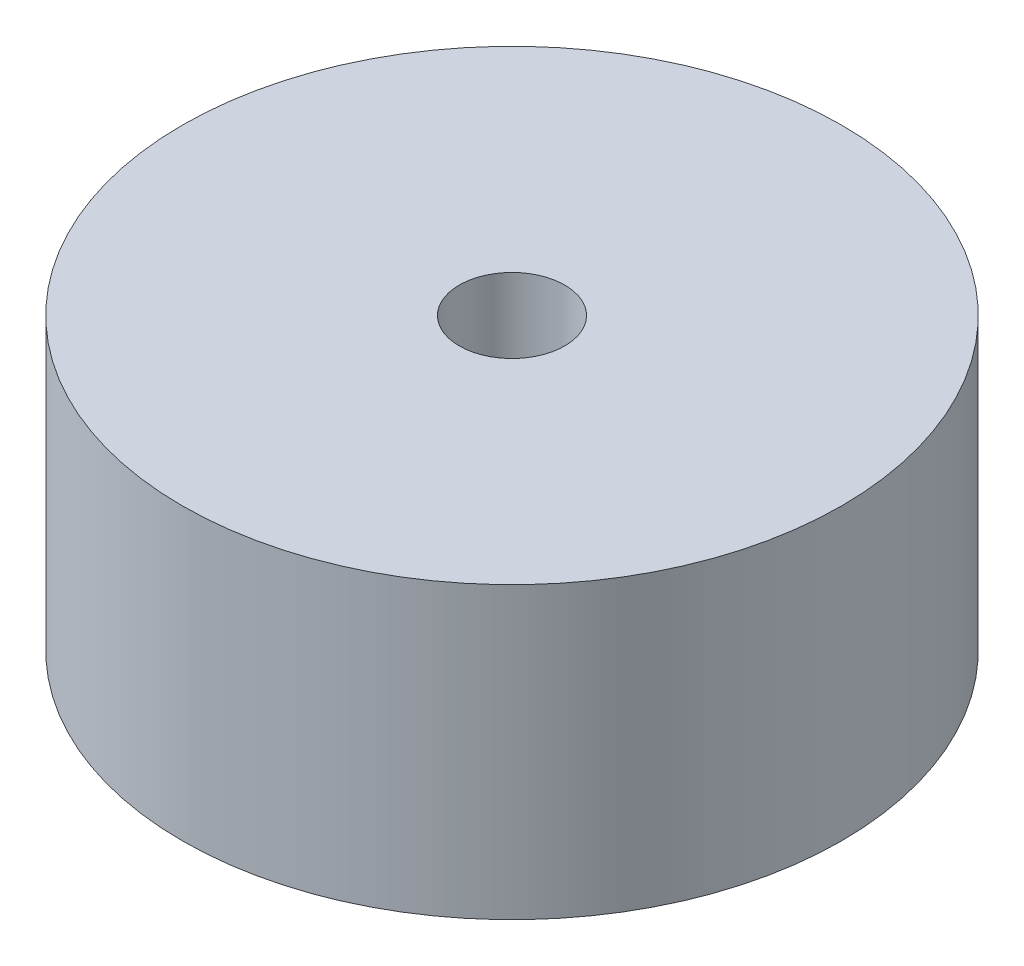
ISO-10303-21;
HEADER;
FILE_DESCRIPTION(('STEP AP214'),'2;1');
FILE_NAME('part.step','',(''),(''),'','','');
FILE_SCHEMA(('AUTOMOTIVE_DESIGN { 1 0 10303 214 1 1 1 1 }'));
ENDSEC;
DATA;
#1=APPLICATION_CONTEXT('core data for automotive mechanical design processes');
#2=APPLICATION_PROTOCOL_DEFINITION('international standard','automotive_design',2000,#1);
#3=PRODUCT_CONTEXT('',#1,'mechanical');
#4=PRODUCT('Part','Part','',(#3));
#5=PRODUCT_RELATED_PRODUCT_CATEGORY('part','',(#4));
#6=PRODUCT_DEFINITION_FORMATION('','',#4);
#7=PRODUCT_DEFINITION_CONTEXT('part definition',#1,'design');
#8=PRODUCT_DEFINITION('design','',#6,#7);
#9=PRODUCT_DEFINITION_SHAPE('','',#8);
#10=(LENGTH_UNIT() NAMED_UNIT(*) SI_UNIT(.MILLI.,.METRE.));
#11=(NAMED_UNIT(*) PLANE_ANGLE_UNIT() SI_UNIT($,.RADIAN.));
#12=(NAMED_UNIT(*) SI_UNIT($,.STERADIAN.) SOLID_ANGLE_UNIT());
#13=UNCERTAINTY_MEASURE_WITH_UNIT(LENGTH_MEASURE(1.E-05),#10,'distance_accuracy_value','');
#14=(GEOMETRIC_REPRESENTATION_CONTEXT(3) GLOBAL_UNCERTAINTY_ASSIGNED_CONTEXT((#13)) GLOBAL_UNIT_ASSIGNED_CONTEXT((#10,
#11,#12)) REPRESENTATION_CONTEXT('',''));
#15=CARTESIAN_POINT('',(0.,0.,0.));
#16=DIRECTION('',(0.,0.,1.));
#17=DIRECTION('',(1.,0.,0.));
#18=AXIS2_PLACEMENT_3D('',#15,#16,#17);
#19=CARTESIAN_POINT('',(0.,0.,0.));
#20=DIRECTION('',(0.,1.,0.));
#21=DIRECTION('',(0.,0.,1.));
#22=AXIS2_PLACEMENT_3D('',#19,#20,#21);
#23=PLANE('',#22);
#24=CARTESIAN_POINT('',(0.,0.,0.));
#25=DIRECTION('',(0.,1.,0.));
#26=DIRECTION('',(0.,0.,1.));
#27=AXIS2_PLACEMENT_3D('',#24,#25,#26);
#28=CIRCLE('',#27,2.);
#29=CARTESIAN_POINT('',(0.,0.,2.));
#30=VERTEX_POINT('',#29);
#31=EDGE_CURVE('E47',#30,#30,#28,.T.);
#32=ORIENTED_EDGE('',*,*,#31,.T.);
#33=EDGE_LOOP('',(#32));
#34=FACE_BOUND('',#33,.T.);
#35=CARTESIAN_POINT('',(0.,0.,0.));
#36=DIRECTION('',(0.,-1.,0.));
#37=DIRECTION('',(0.,0.,-1.));
#38=AXIS2_PLACEMENT_3D('',#35,#36,#37);
#39=CIRCLE('',#38,5.);
#40=CARTESIAN_POINT('',(0.,0.,-5.));
#41=VERTEX_POINT('',#40);
#42=EDGE_CURVE('E57',#41,#41,#39,.T.);
#43=ORIENTED_EDGE('',*,*,#42,.T.);
#44=EDGE_LOOP('',(#43));
#45=FACE_BOUND('',#44,.T.);
#46=ADVANCED_FACE('F32',(#34,#45),#23,.F.);
#47=CARTESIAN_POINT('',(0.,11.,0.));
#48=DIRECTION('',(0.,-1.,0.));
#49=DIRECTION('',(0.,0.,-1.));
#50=AXIS2_PLACEMENT_3D('',#47,#48,#49);
#51=CYLINDRICAL_SURFACE('',#50,12.5);
#52=CARTESIAN_POINT('',(0.,11.,0.));
#53=DIRECTION('',(0.,1.,0.));
#54=DIRECTION('',(0.,0.,1.));
#55=AXIS2_PLACEMENT_3D('',#52,#53,#54);
#56=CIRCLE('',#55,12.5);
#57=CARTESIAN_POINT('',(0.,11.,12.5));
#58=VERTEX_POINT('',#57);
#59=EDGE_CURVE('E10',#58,#58,#56,.T.);
#60=ORIENTED_EDGE('',*,*,#59,.F.);
#61=EDGE_LOOP('',(#60));
#62=FACE_BOUND('',#61,.T.);
#63=CARTESIAN_POINT('',(0.,0.,0.));
#64=DIRECTION('',(0.,1.,0.));
#65=DIRECTION('',(0.,0.,1.));
#66=AXIS2_PLACEMENT_3D('',#63,#64,#65);
#67=CIRCLE('',#66,12.5);
#68=CARTESIAN_POINT('',(0.,0.,12.5));
#69=VERTEX_POINT('',#68);
#70=EDGE_CURVE('E36',#69,#69,#67,.T.);
#71=ORIENTED_EDGE('',*,*,#70,.T.);
#72=EDGE_LOOP('',(#71));
#73=FACE_BOUND('',#72,.T.);
#74=ADVANCED_FACE('F34',(#62,#73),#51,.T.);
#75=CARTESIAN_POINT('',(0.,11.,0.));
#76=DIRECTION('',(0.,1.,0.));
#77=DIRECTION('',(0.,0.,1.));
#78=AXIS2_PLACEMENT_3D('',#75,#76,#77);
#79=PLANE('',#78);
#80=CARTESIAN_POINT('',(0.,11.,0.));
#81=DIRECTION('',(0.,1.,0.));
#82=DIRECTION('',(0.,0.,1.));
#83=AXIS2_PLACEMENT_3D('',#80,#81,#82);
#84=CIRCLE('',#83,2.);
#85=CARTESIAN_POINT('',(0.,11.,2.));
#86=VERTEX_POINT('',#85);
#87=EDGE_CURVE('E43',#86,#86,#84,.T.);
#88=ORIENTED_EDGE('',*,*,#87,.F.);
#89=EDGE_LOOP('',(#88));
#90=FACE_BOUND('',#89,.T.);
#91=ORIENTED_EDGE('',*,*,#59,.T.);
#92=EDGE_LOOP('',(#91));
#93=FACE_BOUND('',#92,.T.);
#94=ADVANCED_FACE('F82',(#90,#93),#79,.T.);
#95=CARTESIAN_POINT('',(0.,0.,0.));
#96=DIRECTION('',(0.,-1.,0.));
#97=DIRECTION('',(0.,0.,-1.));
#98=AXIS2_PLACEMENT_3D('',#95,#96,#97);
#99=CIRCLE('',#98,11.5);
#100=CARTESIAN_POINT('',(0.,0.,-11.5));
#101=VERTEX_POINT('',#100);
#102=EDGE_CURVE('E51',#101,#101,#99,.T.);
#103=ORIENTED_EDGE('',*,*,#102,.F.);
#104=EDGE_LOOP('',(#103));
#105=FACE_BOUND('',#104,.T.);
#106=ORIENTED_EDGE('',*,*,#70,.F.);
#107=EDGE_LOOP('',(#106));
#108=FACE_BOUND('',#107,.T.);
#109=ADVANCED_FACE('F79',(#105,#108),#23,.F.);
#110=CARTESIAN_POINT('',(0.,0.,0.));
#111=DIRECTION('',(0.,1.,0.));
#112=DIRECTION('',(0.,0.,1.));
#113=AXIS2_PLACEMENT_3D('',#110,#111,#112);
#114=CYLINDRICAL_SURFACE('',#113,2.);
#115=ORIENTED_EDGE('',*,*,#87,.T.);
#116=EDGE_LOOP('',(#115));
#117=FACE_BOUND('',#116,.T.);
#118=ORIENTED_EDGE('',*,*,#31,.F.);
#119=EDGE_LOOP('',(#118));
#120=FACE_BOUND('',#119,.T.);
#121=ADVANCED_FACE('F75',(#117,#120),#114,.F.);
#122=CARTESIAN_POINT('',(0.,0.5,0.));
#123=DIRECTION('',(0.,-1.,0.));
#124=DIRECTION('',(0.,0.,-1.));
#125=AXIS2_PLACEMENT_3D('',#122,#123,#124);
#126=CYLINDRICAL_SURFACE('',#125,11.5);
#127=CARTESIAN_POINT('',(0.,0.5,0.));
#128=DIRECTION('',(0.,-1.,0.));
#129=DIRECTION('',(0.,0.,-1.));
#130=AXIS2_PLACEMENT_3D('',#127,#128,#129);
#131=CIRCLE('',#130,11.5);
#132=CARTESIAN_POINT('',(0.,0.5,-11.5));
#133=VERTEX_POINT('',#132);
#134=EDGE_CURVE('E50',#133,#133,#131,.T.);
#135=ORIENTED_EDGE('',*,*,#134,.F.);
#136=EDGE_LOOP('',(#135));
#137=FACE_BOUND('',#136,.T.);
#138=ORIENTED_EDGE('',*,*,#102,.T.);
#139=EDGE_LOOP('',(#138));
#140=FACE_BOUND('',#139,.T.);
#141=ADVANCED_FACE('F69',(#137,#140),#126,.F.);
#142=CARTESIAN_POINT('',(0.,0.5,0.));
#143=DIRECTION('',(0.,-1.,0.));
#144=DIRECTION('',(0.,0.,-1.));
#145=AXIS2_PLACEMENT_3D('',#142,#143,#144);
#146=PLANE('',#145);
#147=CARTESIAN_POINT('',(0.,0.5,0.));
#148=DIRECTION('',(0.,-1.,0.));
#149=DIRECTION('',(0.,0.,-1.));
#150=AXIS2_PLACEMENT_3D('',#147,#148,#149);
#151=CIRCLE('',#150,5.);
#152=CARTESIAN_POINT('',(0.,0.5,-5.));
#153=VERTEX_POINT('',#152);
#154=EDGE_CURVE('E54',#153,#153,#151,.T.);
#155=ORIENTED_EDGE('',*,*,#154,.F.);
#156=EDGE_LOOP('',(#155));
#157=FACE_BOUND('',#156,.T.);
#158=ORIENTED_EDGE('',*,*,#134,.T.);
#159=EDGE_LOOP('',(#158));
#160=FACE_BOUND('',#159,.T.);
#161=ADVANCED_FACE('F66',(#157,#160),#146,.T.);
#162=CARTESIAN_POINT('',(0.,0.5,0.));
#163=DIRECTION('',(0.,-1.,0.));
#164=DIRECTION('',(0.,0.,-1.));
#165=AXIS2_PLACEMENT_3D('',#162,#163,#164);
#166=CYLINDRICAL_SURFACE('',#165,5.);
#167=ORIENTED_EDGE('',*,*,#154,.T.);
#168=EDGE_LOOP('',(#167));
#169=FACE_BOUND('',#168,.T.);
#170=ORIENTED_EDGE('',*,*,#42,.F.);
#171=EDGE_LOOP('',(#170));
#172=FACE_BOUND('',#171,.T.);
#173=ADVANCED_FACE('F63',(#169,#172),#166,.T.);
#174=CLOSED_SHELL('',(#46,#74,#94,#109,#121,#141,#161,#173));
#175=MANIFOLD_SOLID_BREP('B2',#174);
#176=ADVANCED_BREP_SHAPE_REPRESENTATION('',(#18,#175),#14);
#177=SHAPE_DEFINITION_REPRESENTATION(#9,#176);
ENDSEC;
END-ISO-10303-21;
